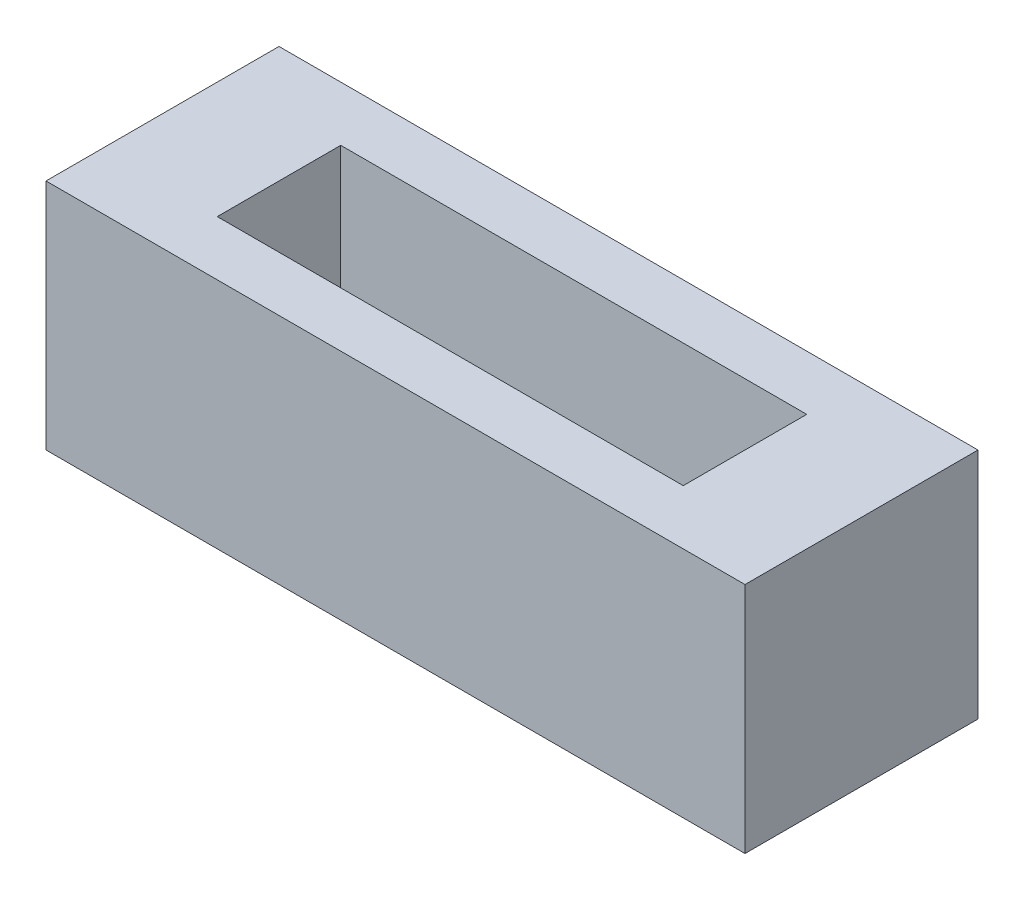
ISO-10303-21;
HEADER;
FILE_DESCRIPTION(('STEP AP214'),'2;1');
FILE_NAME('part.step','',(''),(''),'','','');
FILE_SCHEMA(('AUTOMOTIVE_DESIGN { 1 0 10303 214 1 1 1 1 }'));
ENDSEC;
DATA;
#1=APPLICATION_CONTEXT('core data for automotive mechanical design processes');
#2=APPLICATION_PROTOCOL_DEFINITION('international standard','automotive_design',2000,#1);
#3=PRODUCT_CONTEXT('',#1,'mechanical');
#4=PRODUCT('Part','Part','',(#3));
#5=PRODUCT_RELATED_PRODUCT_CATEGORY('part','',(#4));
#6=PRODUCT_DEFINITION_FORMATION('','',#4);
#7=PRODUCT_DEFINITION_CONTEXT('part definition',#1,'design');
#8=PRODUCT_DEFINITION('design','',#6,#7);
#9=PRODUCT_DEFINITION_SHAPE('','',#8);
#10=(LENGTH_UNIT() NAMED_UNIT(*) SI_UNIT(.MILLI.,.METRE.));
#11=(NAMED_UNIT(*) PLANE_ANGLE_UNIT() SI_UNIT($,.RADIAN.));
#12=(NAMED_UNIT(*) SI_UNIT($,.STERADIAN.) SOLID_ANGLE_UNIT());
#13=UNCERTAINTY_MEASURE_WITH_UNIT(LENGTH_MEASURE(1.E-05),#10,'distance_accuracy_value','');
#14=(GEOMETRIC_REPRESENTATION_CONTEXT(3) GLOBAL_UNCERTAINTY_ASSIGNED_CONTEXT((#13)) GLOBAL_UNIT_ASSIGNED_CONTEXT((#10,
#11,#12)) REPRESENTATION_CONTEXT('',''));
#15=CARTESIAN_POINT('',(0.,0.,0.));
#16=DIRECTION('',(0.,0.,1.));
#17=DIRECTION('',(1.,0.,0.));
#18=AXIS2_PLACEMENT_3D('',#15,#16,#17);
#19=CARTESIAN_POINT('',(19.05,12.7,6.35));
#20=DIRECTION('',(-1.,0.,0.));
#21=DIRECTION('',(0.,0.,1.));
#22=AXIS2_PLACEMENT_3D('',#19,#20,#21);
#23=PLANE('',#22);
#24=DIRECTION('',(0.,0.,-1.));
#25=VECTOR('',#24,1.);
#26=CARTESIAN_POINT('',(19.05,0.,6.35));
#27=LINE('',#26,#25);
#28=CARTESIAN_POINT('',(19.05,0.,6.35));
#29=VERTEX_POINT('',#28);
#30=CARTESIAN_POINT('',(19.05,0.,-6.35));
#31=VERTEX_POINT('',#30);
#32=EDGE_CURVE('E147',#29,#31,#27,.T.);
#33=ORIENTED_EDGE('',*,*,#32,.T.);
#34=DIRECTION('',(0.,-1.,0.));
#35=VECTOR('',#34,1.);
#36=CARTESIAN_POINT('',(19.05,12.7,-6.35));
#37=LINE('',#36,#35);
#38=CARTESIAN_POINT('',(19.05,12.7,-6.35));
#39=VERTEX_POINT('',#38);
#40=EDGE_CURVE('E11',#39,#31,#37,.T.);
#41=ORIENTED_EDGE('',*,*,#40,.F.);
#42=DIRECTION('',(0.,0.,-1.));
#43=VECTOR('',#42,1.);
#44=CARTESIAN_POINT('',(19.05,12.7,6.35));
#45=LINE('',#44,#43);
#46=CARTESIAN_POINT('',(19.05,12.7,6.35));
#47=VERTEX_POINT('',#46);
#48=EDGE_CURVE('E153',#47,#39,#45,.T.);
#49=ORIENTED_EDGE('',*,*,#48,.F.);
#50=DIRECTION('',(0.,-1.,0.));
#51=VECTOR('',#50,1.);
#52=CARTESIAN_POINT('',(19.05,12.7,6.35));
#53=LINE('',#52,#51);
#54=EDGE_CURVE('E167',#47,#29,#53,.T.);
#55=ORIENTED_EDGE('',*,*,#54,.T.);
#56=EDGE_LOOP('',(#33,#41,#49,#55));
#57=FACE_BOUND('',#56,.T.);
#58=ADVANCED_FACE('F39',(#57),#23,.F.);
#59=CARTESIAN_POINT('',(-19.05,12.7,-6.35));
#60=DIRECTION('',(0.,0.,1.));
#61=DIRECTION('',(1.,0.,0.));
#62=AXIS2_PLACEMENT_3D('',#59,#60,#61);
#63=PLANE('',#62);
#64=DIRECTION('',(-1.,0.,0.));
#65=VECTOR('',#64,1.);
#66=CARTESIAN_POINT('',(-19.05,0.,-6.35));
#67=LINE('',#66,#65);
#68=CARTESIAN_POINT('',(-19.05,0.,-6.35));
#69=VERTEX_POINT('',#68);
#70=EDGE_CURVE('E171',#31,#69,#67,.T.);
#71=ORIENTED_EDGE('',*,*,#70,.T.);
#72=DIRECTION('',(0.,-1.,0.));
#73=VECTOR('',#72,1.);
#74=CARTESIAN_POINT('',(-19.05,12.7,-6.35));
#75=LINE('',#74,#73);
#76=CARTESIAN_POINT('',(-19.05,12.7,-6.35));
#77=VERTEX_POINT('',#76);
#78=EDGE_CURVE('E47',#77,#69,#75,.T.);
#79=ORIENTED_EDGE('',*,*,#78,.F.);
#80=DIRECTION('',(-1.,0.,0.));
#81=VECTOR('',#80,1.);
#82=CARTESIAN_POINT('',(-19.05,12.7,-6.35));
#83=LINE('',#82,#81);
#84=EDGE_CURVE('E157',#39,#77,#83,.T.);
#85=ORIENTED_EDGE('',*,*,#84,.F.);
#86=ORIENTED_EDGE('',*,*,#40,.T.);
#87=EDGE_LOOP('',(#71,#79,#85,#86));
#88=FACE_BOUND('',#87,.T.);
#89=ADVANCED_FACE('F205',(#88),#63,.F.);
#90=CARTESIAN_POINT('',(-19.05,12.7,6.35));
#91=DIRECTION('',(1.,0.,0.));
#92=DIRECTION('',(0.,0.,-1.));
#93=AXIS2_PLACEMENT_3D('',#90,#91,#92);
#94=PLANE('',#93);
#95=DIRECTION('',(0.,0.,1.));
#96=VECTOR('',#95,1.);
#97=CARTESIAN_POINT('',(-19.05,0.,6.35));
#98=LINE('',#97,#96);
#99=CARTESIAN_POINT('',(-19.05,0.,6.35));
#100=VERTEX_POINT('',#99);
#101=EDGE_CURVE('E174',#69,#100,#98,.T.);
#102=ORIENTED_EDGE('',*,*,#101,.T.);
#103=DIRECTION('',(0.,-1.,0.));
#104=VECTOR('',#103,1.);
#105=CARTESIAN_POINT('',(-19.05,12.7,6.35));
#106=LINE('',#105,#104);
#107=CARTESIAN_POINT('',(-19.05,12.7,6.35));
#108=VERTEX_POINT('',#107);
#109=EDGE_CURVE('E182',#108,#100,#106,.T.);
#110=ORIENTED_EDGE('',*,*,#109,.F.);
#111=DIRECTION('',(0.,0.,1.));
#112=VECTOR('',#111,1.);
#113=CARTESIAN_POINT('',(-19.05,12.7,6.35));
#114=LINE('',#113,#112);
#115=EDGE_CURVE('E161',#77,#108,#114,.T.);
#116=ORIENTED_EDGE('',*,*,#115,.F.);
#117=ORIENTED_EDGE('',*,*,#78,.T.);
#118=EDGE_LOOP('',(#102,#110,#116,#117));
#119=FACE_BOUND('',#118,.T.);
#120=ADVANCED_FACE('F191',(#119),#94,.F.);
#121=CARTESIAN_POINT('',(-19.05,12.7,6.35));
#122=DIRECTION('',(0.,0.,-1.));
#123=DIRECTION('',(-1.,0.,0.));
#124=AXIS2_PLACEMENT_3D('',#121,#122,#123);
#125=PLANE('',#124);
#126=DIRECTION('',(1.,0.,0.));
#127=VECTOR('',#126,1.);
#128=CARTESIAN_POINT('',(-19.05,0.,6.35));
#129=LINE('',#128,#127);
#130=EDGE_CURVE('E158',#100,#29,#129,.T.);
#131=ORIENTED_EDGE('',*,*,#130,.T.);
#132=ORIENTED_EDGE('',*,*,#54,.F.);
#133=DIRECTION('',(1.,0.,0.));
#134=VECTOR('',#133,1.);
#135=CARTESIAN_POINT('',(-19.05,12.7,6.35));
#136=LINE('',#135,#134);
#137=EDGE_CURVE('E164',#108,#47,#136,.T.);
#138=ORIENTED_EDGE('',*,*,#137,.F.);
#139=ORIENTED_EDGE('',*,*,#109,.T.);
#140=EDGE_LOOP('',(#131,#132,#138,#139));
#141=FACE_BOUND('',#140,.T.);
#142=ADVANCED_FACE('F198',(#141),#125,.F.);
#143=CARTESIAN_POINT('',(0.,12.7,0.));
#144=DIRECTION('',(0.,-1.,0.));
#145=DIRECTION('',(0.,0.,-1.));
#146=AXIS2_PLACEMENT_3D('',#143,#144,#145);
#147=PLANE('',#146);
#148=DIRECTION('',(-1.,0.,0.));
#149=VECTOR('',#148,1.);
#150=CARTESIAN_POINT('',(-12.7,12.7,-3.3655));
#151=LINE('',#150,#149);
#152=CARTESIAN_POINT('',(12.7,12.7,-3.3655));
#153=VERTEX_POINT('',#152);
#154=CARTESIAN_POINT('',(-12.7,12.7,-3.3655));
#155=VERTEX_POINT('',#154);
#156=EDGE_CURVE('E138',#153,#155,#151,.T.);
#157=ORIENTED_EDGE('',*,*,#156,.F.);
#158=DIRECTION('',(0.,0.,-1.));
#159=VECTOR('',#158,1.);
#160=CARTESIAN_POINT('',(12.7,12.7,3.3655));
#161=LINE('',#160,#159);
#162=CARTESIAN_POINT('',(12.7,12.7,3.3655));
#163=VERTEX_POINT('',#162);
#164=EDGE_CURVE('E54',#163,#153,#161,.T.);
#165=ORIENTED_EDGE('',*,*,#164,.F.);
#166=DIRECTION('',(1.,0.,0.));
#167=VECTOR('',#166,1.);
#168=CARTESIAN_POINT('',(-12.7,12.7,3.3655));
#169=LINE('',#168,#167);
#170=CARTESIAN_POINT('',(-12.7,12.7,3.3655));
#171=VERTEX_POINT('',#170);
#172=EDGE_CURVE('E125',#171,#163,#169,.T.);
#173=ORIENTED_EDGE('',*,*,#172,.F.);
#174=DIRECTION('',(0.,0.,1.));
#175=VECTOR('',#174,1.);
#176=CARTESIAN_POINT('',(-12.7,12.7,3.3655));
#177=LINE('',#176,#175);
#178=EDGE_CURVE('E129',#155,#171,#177,.T.);
#179=ORIENTED_EDGE('',*,*,#178,.F.);
#180=EDGE_LOOP('',(#157,#165,#173,#179));
#181=FACE_BOUND('',#180,.T.);
#182=ORIENTED_EDGE('',*,*,#48,.T.);
#183=ORIENTED_EDGE('',*,*,#84,.T.);
#184=ORIENTED_EDGE('',*,*,#115,.T.);
#185=ORIENTED_EDGE('',*,*,#137,.T.);
#186=EDGE_LOOP('',(#182,#183,#184,#185));
#187=FACE_BOUND('',#186,.T.);
#188=ADVANCED_FACE('F204',(#181,#187),#147,.F.);
#189=CARTESIAN_POINT('',(0.,0.,0.));
#190=DIRECTION('',(0.,-1.,0.));
#191=DIRECTION('',(0.,0.,-1.));
#192=AXIS2_PLACEMENT_3D('',#189,#190,#191);
#193=PLANE('',#192);
#194=DIRECTION('',(0.,0.,-1.));
#195=VECTOR('',#194,1.);
#196=CARTESIAN_POINT('',(12.7,0.,3.3655));
#197=LINE('',#196,#195);
#198=CARTESIAN_POINT('',(12.7,0.,3.3655));
#199=VERTEX_POINT('',#198);
#200=CARTESIAN_POINT('',(12.7,0.,-3.3655));
#201=VERTEX_POINT('',#200);
#202=EDGE_CURVE('E106',#199,#201,#197,.T.);
#203=ORIENTED_EDGE('',*,*,#202,.T.);
#204=DIRECTION('',(-1.,0.,0.));
#205=VECTOR('',#204,1.);
#206=CARTESIAN_POINT('',(-12.7,0.,-3.3655));
#207=LINE('',#206,#205);
#208=CARTESIAN_POINT('',(-12.7,0.,-3.3655));
#209=VERTEX_POINT('',#208);
#210=EDGE_CURVE('E116',#201,#209,#207,.T.);
#211=ORIENTED_EDGE('',*,*,#210,.T.);
#212=DIRECTION('',(0.,0.,1.));
#213=VECTOR('',#212,1.);
#214=CARTESIAN_POINT('',(-12.7,0.,3.3655));
#215=LINE('',#214,#213);
#216=CARTESIAN_POINT('',(-12.7,0.,3.3655));
#217=VERTEX_POINT('',#216);
#218=EDGE_CURVE('E62',#209,#217,#215,.T.);
#219=ORIENTED_EDGE('',*,*,#218,.T.);
#220=DIRECTION('',(1.,0.,0.));
#221=VECTOR('',#220,1.);
#222=CARTESIAN_POINT('',(-12.7,0.,3.3655));
#223=LINE('',#222,#221);
#224=EDGE_CURVE('E113',#217,#199,#223,.T.);
#225=ORIENTED_EDGE('',*,*,#224,.T.);
#226=EDGE_LOOP('',(#203,#211,#219,#225));
#227=FACE_BOUND('',#226,.T.);
#228=ORIENTED_EDGE('',*,*,#32,.F.);
#229=ORIENTED_EDGE('',*,*,#130,.F.);
#230=ORIENTED_EDGE('',*,*,#101,.F.);
#231=ORIENTED_EDGE('',*,*,#70,.F.);
#232=EDGE_LOOP('',(#228,#229,#230,#231));
#233=FACE_BOUND('',#232,.T.);
#234=ADVANCED_FACE('F121',(#227,#233),#193,.T.);
#235=CARTESIAN_POINT('',(12.7,0.,3.3655));
#236=DIRECTION('',(1.,0.,0.));
#237=DIRECTION('',(0.,0.,-1.));
#238=AXIS2_PLACEMENT_3D('',#235,#236,#237);
#239=PLANE('',#238);
#240=ORIENTED_EDGE('',*,*,#164,.T.);
#241=DIRECTION('',(0.,1.,0.));
#242=VECTOR('',#241,1.);
#243=CARTESIAN_POINT('',(12.7,0.,-3.3655));
#244=LINE('',#243,#242);
#245=EDGE_CURVE('E102',#201,#153,#244,.T.);
#246=ORIENTED_EDGE('',*,*,#245,.F.);
#247=ORIENTED_EDGE('',*,*,#202,.F.);
#248=DIRECTION('',(0.,1.,0.));
#249=VECTOR('',#248,1.);
#250=CARTESIAN_POINT('',(12.7,0.,3.3655));
#251=LINE('',#250,#249);
#252=EDGE_CURVE('E144',#199,#163,#251,.T.);
#253=ORIENTED_EDGE('',*,*,#252,.T.);
#254=EDGE_LOOP('',(#240,#246,#247,#253));
#255=FACE_BOUND('',#254,.T.);
#256=ADVANCED_FACE('F104',(#255),#239,.F.);
#257=CARTESIAN_POINT('',(-12.7,0.,3.3655));
#258=DIRECTION('',(0.,0.,1.));
#259=DIRECTION('',(1.,0.,0.));
#260=AXIS2_PLACEMENT_3D('',#257,#258,#259);
#261=PLANE('',#260);
#262=ORIENTED_EDGE('',*,*,#172,.T.);
#263=ORIENTED_EDGE('',*,*,#252,.F.);
#264=ORIENTED_EDGE('',*,*,#224,.F.);
#265=DIRECTION('',(0.,1.,0.));
#266=VECTOR('',#265,1.);
#267=CARTESIAN_POINT('',(-12.7,0.,3.3655));
#268=LINE('',#267,#266);
#269=EDGE_CURVE('E148',#217,#171,#268,.T.);
#270=ORIENTED_EDGE('',*,*,#269,.T.);
#271=EDGE_LOOP('',(#262,#263,#264,#270));
#272=FACE_BOUND('',#271,.T.);
#273=ADVANCED_FACE('F222',(#272),#261,.F.);
#274=CARTESIAN_POINT('',(-12.7,0.,3.3655));
#275=DIRECTION('',(-1.,0.,0.));
#276=DIRECTION('',(0.,0.,1.));
#277=AXIS2_PLACEMENT_3D('',#274,#275,#276);
#278=PLANE('',#277);
#279=ORIENTED_EDGE('',*,*,#178,.T.);
#280=ORIENTED_EDGE('',*,*,#269,.F.);
#281=ORIENTED_EDGE('',*,*,#218,.F.);
#282=DIRECTION('',(0.,1.,0.));
#283=VECTOR('',#282,1.);
#284=CARTESIAN_POINT('',(-12.7,0.,-3.3655));
#285=LINE('',#284,#283);
#286=EDGE_CURVE('E112',#209,#155,#285,.T.);
#287=ORIENTED_EDGE('',*,*,#286,.T.);
#288=EDGE_LOOP('',(#279,#280,#281,#287));
#289=FACE_BOUND('',#288,.T.);
#290=ADVANCED_FACE('F225',(#289),#278,.F.);
#291=CARTESIAN_POINT('',(-12.7,0.,-3.3655));
#292=DIRECTION('',(0.,0.,-1.));
#293=DIRECTION('',(-1.,0.,0.));
#294=AXIS2_PLACEMENT_3D('',#291,#292,#293);
#295=PLANE('',#294);
#296=ORIENTED_EDGE('',*,*,#156,.T.);
#297=ORIENTED_EDGE('',*,*,#286,.F.);
#298=ORIENTED_EDGE('',*,*,#210,.F.);
#299=ORIENTED_EDGE('',*,*,#245,.T.);
#300=EDGE_LOOP('',(#296,#297,#298,#299));
#301=FACE_BOUND('',#300,.T.);
#302=ADVANCED_FACE('F117',(#301),#295,.F.);
#303=CLOSED_SHELL('',(#58,#89,#120,#142,#188,#234,#256,#273,#290,#302));
#304=MANIFOLD_SOLID_BREP('B2',#303);
#305=ADVANCED_BREP_SHAPE_REPRESENTATION('',(#18,#304),#14);
#306=SHAPE_DEFINITION_REPRESENTATION(#9,#305);
ENDSEC;
END-ISO-10303-21;
